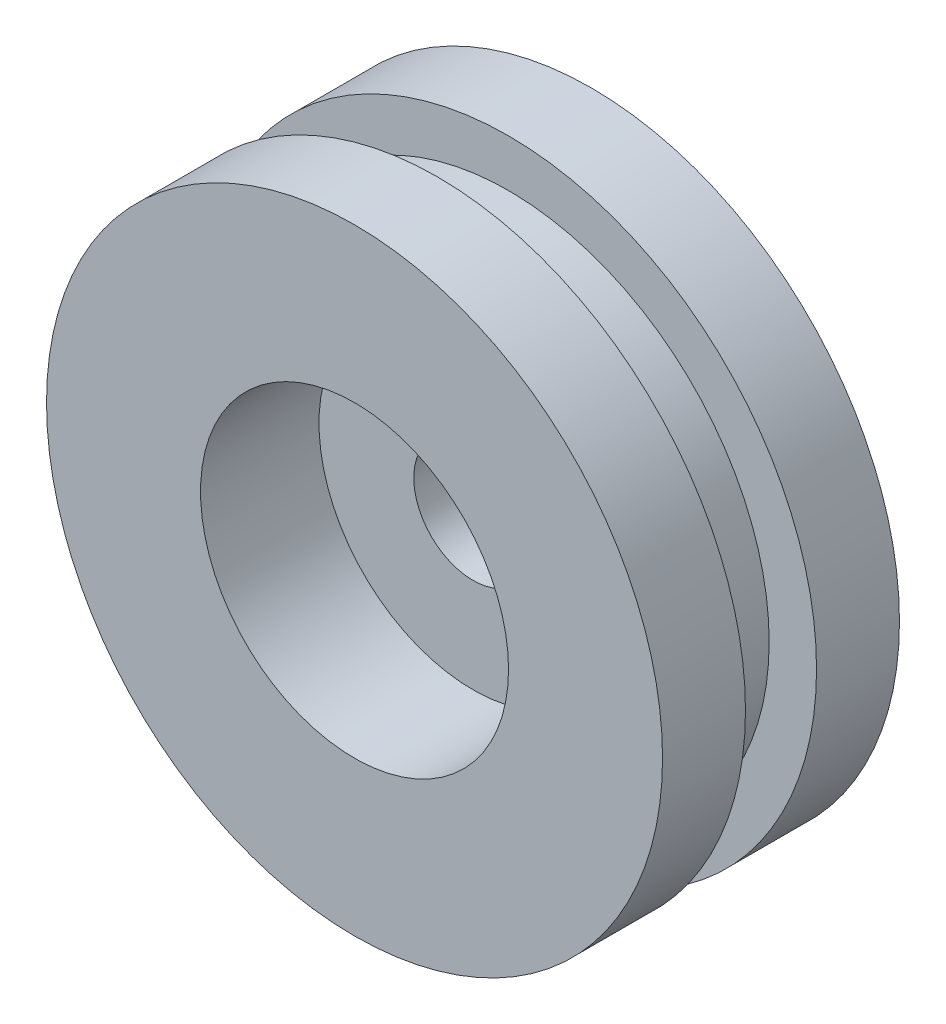
ISO-10303-21;
HEADER;
FILE_DESCRIPTION(('STEP AP214'),'2;1');
FILE_NAME('part.step','',(''),(''),'','','');
FILE_SCHEMA(('AUTOMOTIVE_DESIGN { 1 0 10303 214 1 1 1 1 }'));
ENDSEC;
DATA;
#1=APPLICATION_CONTEXT('core data for automotive mechanical design processes');
#2=APPLICATION_PROTOCOL_DEFINITION('international standard','automotive_design',2000,#1);
#3=PRODUCT_CONTEXT('',#1,'mechanical');
#4=PRODUCT('Part','Part','',(#3));
#5=PRODUCT_RELATED_PRODUCT_CATEGORY('part','',(#4));
#6=PRODUCT_DEFINITION_FORMATION('','',#4);
#7=PRODUCT_DEFINITION_CONTEXT('part definition',#1,'design');
#8=PRODUCT_DEFINITION('design','',#6,#7);
#9=PRODUCT_DEFINITION_SHAPE('','',#8);
#10=(LENGTH_UNIT() NAMED_UNIT(*) SI_UNIT(.MILLI.,.METRE.));
#11=(NAMED_UNIT(*) PLANE_ANGLE_UNIT() SI_UNIT($,.RADIAN.));
#12=(NAMED_UNIT(*) SI_UNIT($,.STERADIAN.) SOLID_ANGLE_UNIT());
#13=UNCERTAINTY_MEASURE_WITH_UNIT(LENGTH_MEASURE(1.E-05),#10,'distance_accuracy_value','');
#14=(GEOMETRIC_REPRESENTATION_CONTEXT(3) GLOBAL_UNCERTAINTY_ASSIGNED_CONTEXT((#13)) GLOBAL_UNIT_ASSIGNED_CONTEXT((#10,
#11,#12)) REPRESENTATION_CONTEXT('',''));
#15=CARTESIAN_POINT('',(0.,0.,0.));
#16=DIRECTION('',(0.,0.,1.));
#17=DIRECTION('',(1.,0.,0.));
#18=AXIS2_PLACEMENT_3D('',#15,#16,#17);
#19=CARTESIAN_POINT('',(0.,0.,5.));
#20=DIRECTION('',(0.,0.,-1.));
#21=DIRECTION('',(-1.,0.,0.));
#22=AXIS2_PLACEMENT_3D('',#19,#20,#21);
#23=CYLINDRICAL_SURFACE('',#22,11.);
#24=CARTESIAN_POINT('',(0.,0.,-1.5));
#25=DIRECTION('',(0.,0.,1.));
#26=DIRECTION('',(1.,0.,0.));
#27=AXIS2_PLACEMENT_3D('',#24,#25,#26);
#28=CIRCLE('',#27,11.);
#29=CARTESIAN_POINT('',(11.,0.,-1.5));
#30=VERTEX_POINT('',#29);
#31=EDGE_CURVE('E67',#30,#30,#28,.T.);
#32=ORIENTED_EDGE('',*,*,#31,.T.);
#33=EDGE_LOOP('',(#32));
#34=FACE_BOUND('',#33,.T.);
#35=CARTESIAN_POINT('',(0.,0.,1.5));
#36=DIRECTION('',(0.,0.,1.));
#37=DIRECTION('',(1.,0.,0.));
#38=AXIS2_PLACEMENT_3D('',#35,#36,#37);
#39=CIRCLE('',#38,11.);
#40=CARTESIAN_POINT('',(11.,0.,1.5));
#41=VERTEX_POINT('',#40);
#42=EDGE_CURVE('E41',#41,#41,#39,.T.);
#43=ORIENTED_EDGE('',*,*,#42,.F.);
#44=EDGE_LOOP('',(#43));
#45=FACE_BOUND('',#44,.T.);
#46=ADVANCED_FACE('F34',(#34,#45),#23,.T.);
#47=CARTESIAN_POINT('',(0.,0.,5.));
#48=DIRECTION('',(0.,0.,-1.));
#49=DIRECTION('',(-1.,0.,0.));
#50=AXIS2_PLACEMENT_3D('',#47,#48,#49);
#51=CYLINDRICAL_SURFACE('',#50,6.5);
#52=CARTESIAN_POINT('',(0.,0.,0.));
#53=DIRECTION('',(0.,0.,1.));
#54=DIRECTION('',(1.,0.,0.));
#55=AXIS2_PLACEMENT_3D('',#52,#53,#54);
#56=CIRCLE('',#55,6.5);
#57=CARTESIAN_POINT('',(6.5,0.,0.));
#58=VERTEX_POINT('',#57);
#59=EDGE_CURVE('E10',#58,#58,#56,.T.);
#60=ORIENTED_EDGE('',*,*,#59,.F.);
#61=EDGE_LOOP('',(#60));
#62=FACE_BOUND('',#61,.T.);
#63=CARTESIAN_POINT('',(0.,0.,5.));
#64=DIRECTION('',(0.,0.,1.));
#65=DIRECTION('',(1.,0.,0.));
#66=AXIS2_PLACEMENT_3D('',#63,#64,#65);
#67=CIRCLE('',#66,6.5);
#68=CARTESIAN_POINT('',(6.5,0.,5.));
#69=VERTEX_POINT('',#68);
#70=EDGE_CURVE('E45',#69,#69,#67,.T.);
#71=ORIENTED_EDGE('',*,*,#70,.T.);
#72=EDGE_LOOP('',(#71));
#73=FACE_BOUND('',#72,.T.);
#74=ADVANCED_FACE('F36',(#62,#73),#51,.F.);
#75=CARTESIAN_POINT('',(0.,0.,5.));
#76=DIRECTION('',(0.,0.,1.));
#77=DIRECTION('',(1.,0.,0.));
#78=AXIS2_PLACEMENT_3D('',#75,#76,#77);
#79=PLANE('',#78);
#80=ORIENTED_EDGE('',*,*,#70,.F.);
#81=EDGE_LOOP('',(#80));
#82=FACE_BOUND('',#81,.T.);
#83=CARTESIAN_POINT('',(0.,0.,5.));
#84=DIRECTION('',(0.,0.,1.));
#85=DIRECTION('',(1.,0.,0.));
#86=AXIS2_PLACEMENT_3D('',#83,#84,#85);
#87=CIRCLE('',#86,13.);
#88=CARTESIAN_POINT('',(13.,0.,5.));
#89=VERTEX_POINT('',#88);
#90=EDGE_CURVE('E49',#89,#89,#87,.T.);
#91=ORIENTED_EDGE('',*,*,#90,.T.);
#92=EDGE_LOOP('',(#91));
#93=FACE_BOUND('',#92,.T.);
#94=ADVANCED_FACE('F79',(#82,#93),#79,.T.);
#95=CARTESIAN_POINT('',(0.,0.,-5.));
#96=DIRECTION('',(0.,0.,1.));
#97=DIRECTION('',(1.,0.,0.));
#98=AXIS2_PLACEMENT_3D('',#95,#96,#97);
#99=PLANE('',#98);
#100=CARTESIAN_POINT('',(0.,0.,-5.));
#101=DIRECTION('',(0.,0.,1.));
#102=DIRECTION('',(1.,0.,0.));
#103=AXIS2_PLACEMENT_3D('',#100,#101,#102);
#104=CIRCLE('',#103,2.5);
#105=CARTESIAN_POINT('',(2.5,0.,-5.));
#106=VERTEX_POINT('',#105);
#107=EDGE_CURVE('E55',#106,#106,#104,.T.);
#108=ORIENTED_EDGE('',*,*,#107,.T.);
#109=EDGE_LOOP('',(#108));
#110=FACE_BOUND('',#109,.T.);
#111=CARTESIAN_POINT('',(0.,0.,-5.));
#112=DIRECTION('',(0.,0.,1.));
#113=DIRECTION('',(1.,0.,0.));
#114=AXIS2_PLACEMENT_3D('',#111,#112,#113);
#115=CIRCLE('',#114,13.);
#116=CARTESIAN_POINT('',(13.,0.,-5.));
#117=VERTEX_POINT('',#116);
#118=EDGE_CURVE('E61',#117,#117,#115,.T.);
#119=ORIENTED_EDGE('',*,*,#118,.F.);
#120=EDGE_LOOP('',(#119));
#121=FACE_BOUND('',#120,.T.);
#122=ADVANCED_FACE('F76',(#110,#121),#99,.F.);
#123=CARTESIAN_POINT('',(0.,0.,5.));
#124=DIRECTION('',(0.,0.,-1.));
#125=DIRECTION('',(-1.,0.,0.));
#126=AXIS2_PLACEMENT_3D('',#123,#124,#125);
#127=CYLINDRICAL_SURFACE('',#126,13.);
#128=ORIENTED_EDGE('',*,*,#90,.F.);
#129=EDGE_LOOP('',(#128));
#130=FACE_BOUND('',#129,.T.);
#131=CARTESIAN_POINT('',(0.,0.,1.5));
#132=DIRECTION('',(0.,0.,1.));
#133=DIRECTION('',(1.,0.,0.));
#134=AXIS2_PLACEMENT_3D('',#131,#132,#133);
#135=CIRCLE('',#134,13.);
#136=CARTESIAN_POINT('',(13.,0.,1.5));
#137=VERTEX_POINT('',#136);
#138=EDGE_CURVE('E52',#137,#137,#135,.T.);
#139=ORIENTED_EDGE('',*,*,#138,.T.);
#140=EDGE_LOOP('',(#139));
#141=FACE_BOUND('',#140,.T.);
#142=ADVANCED_FACE('F78',(#130,#141),#127,.T.);
#143=CARTESIAN_POINT('',(0.,0.,1.5));
#144=DIRECTION('',(0.,0.,1.));
#145=DIRECTION('',(1.,0.,0.));
#146=AXIS2_PLACEMENT_3D('',#143,#144,#145);
#147=PLANE('',#146);
#148=ORIENTED_EDGE('',*,*,#42,.T.);
#149=EDGE_LOOP('',(#148));
#150=FACE_BOUND('',#149,.T.);
#151=ORIENTED_EDGE('',*,*,#138,.F.);
#152=EDGE_LOOP('',(#151));
#153=FACE_BOUND('',#152,.T.);
#154=ADVANCED_FACE('F86',(#150,#153),#147,.F.);
#155=CARTESIAN_POINT('',(0.,0.,-5.));
#156=DIRECTION('',(0.,0.,1.));
#157=DIRECTION('',(1.,0.,0.));
#158=AXIS2_PLACEMENT_3D('',#155,#156,#157);
#159=CYLINDRICAL_SURFACE('',#158,2.5);
#160=ORIENTED_EDGE('',*,*,#107,.F.);
#161=EDGE_LOOP('',(#160));
#162=FACE_BOUND('',#161,.T.);
#163=CARTESIAN_POINT('',(0.,0.,0.));
#164=DIRECTION('',(0.,0.,1.));
#165=DIRECTION('',(1.,0.,0.));
#166=AXIS2_PLACEMENT_3D('',#163,#164,#165);
#167=CIRCLE('',#166,2.5);
#168=CARTESIAN_POINT('',(2.5,0.,0.));
#169=VERTEX_POINT('',#168);
#170=EDGE_CURVE('E58',#169,#169,#167,.T.);
#171=ORIENTED_EDGE('',*,*,#170,.T.);
#172=EDGE_LOOP('',(#171));
#173=FACE_BOUND('',#172,.T.);
#174=ADVANCED_FACE('F111',(#162,#173),#159,.F.);
#175=CARTESIAN_POINT('',(0.,0.,0.));
#176=DIRECTION('',(0.,0.,1.));
#177=DIRECTION('',(1.,0.,0.));
#178=AXIS2_PLACEMENT_3D('',#175,#176,#177);
#179=PLANE('',#178);
#180=ORIENTED_EDGE('',*,*,#170,.F.);
#181=EDGE_LOOP('',(#180));
#182=FACE_BOUND('',#181,.T.);
#183=ORIENTED_EDGE('',*,*,#59,.T.);
#184=EDGE_LOOP('',(#183));
#185=FACE_BOUND('',#184,.T.);
#186=ADVANCED_FACE('F106',(#182,#185),#179,.T.);
#187=CARTESIAN_POINT('',(0.,0.,-5.));
#188=DIRECTION('',(0.,0.,1.));
#189=DIRECTION('',(1.,0.,0.));
#190=AXIS2_PLACEMENT_3D('',#187,#188,#189);
#191=CYLINDRICAL_SURFACE('',#190,13.);
#192=ORIENTED_EDGE('',*,*,#118,.T.);
#193=EDGE_LOOP('',(#192));
#194=FACE_BOUND('',#193,.T.);
#195=CARTESIAN_POINT('',(0.,0.,-1.5));
#196=DIRECTION('',(0.,0.,1.));
#197=DIRECTION('',(1.,0.,0.));
#198=AXIS2_PLACEMENT_3D('',#195,#196,#197);
#199=CIRCLE('',#198,13.);
#200=CARTESIAN_POINT('',(13.,0.,-1.5));
#201=VERTEX_POINT('',#200);
#202=EDGE_CURVE('E64',#201,#201,#199,.T.);
#203=ORIENTED_EDGE('',*,*,#202,.F.);
#204=EDGE_LOOP('',(#203));
#205=FACE_BOUND('',#204,.T.);
#206=ADVANCED_FACE('F73',(#194,#205),#191,.T.);
#207=CARTESIAN_POINT('',(0.,0.,-1.5));
#208=DIRECTION('',(0.,0.,1.));
#209=DIRECTION('',(1.,0.,0.));
#210=AXIS2_PLACEMENT_3D('',#207,#208,#209);
#211=PLANE('',#210);
#212=ORIENTED_EDGE('',*,*,#31,.F.);
#213=EDGE_LOOP('',(#212));
#214=FACE_BOUND('',#213,.T.);
#215=ORIENTED_EDGE('',*,*,#202,.T.);
#216=EDGE_LOOP('',(#215));
#217=FACE_BOUND('',#216,.T.);
#218=ADVANCED_FACE('F100',(#214,#217),#211,.T.);
#219=CLOSED_SHELL('',(#46,#74,#94,#122,#142,#154,#174,#186,#206,#218));
#220=MANIFOLD_SOLID_BREP('B2',#219);
#221=ADVANCED_BREP_SHAPE_REPRESENTATION('',(#18,#220),#14);
#222=SHAPE_DEFINITION_REPRESENTATION(#9,#221);
ENDSEC;
END-ISO-10303-21;
